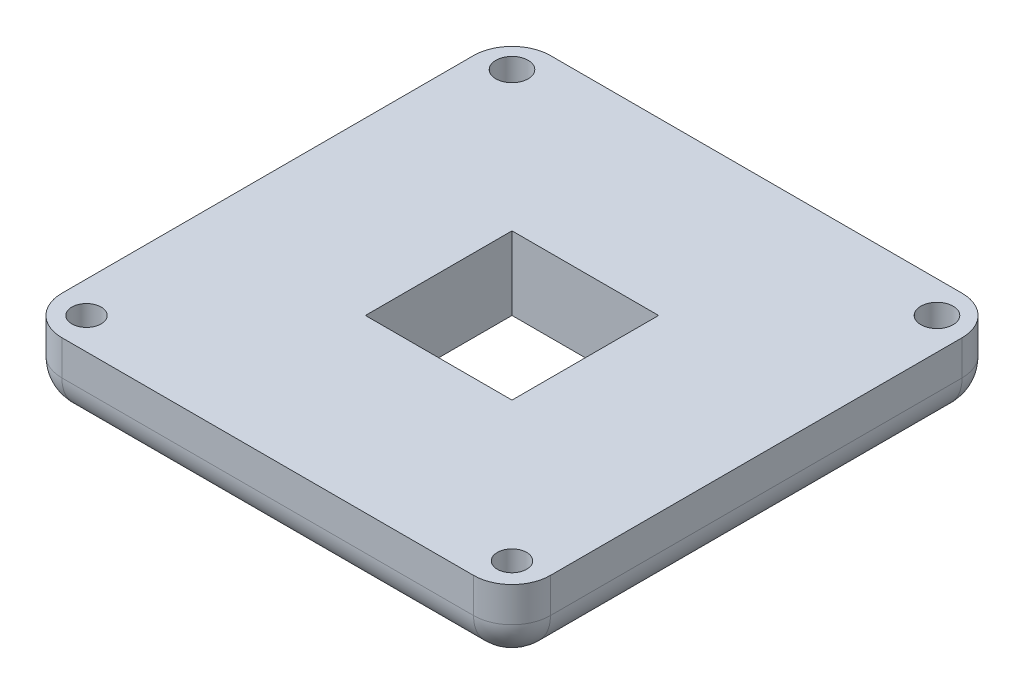
ISO-10303-21;
HEADER;
FILE_DESCRIPTION(('STEP AP214'),'2;1');
FILE_NAME('part.step','',(''),(''),'','','');
FILE_SCHEMA(('AUTOMOTIVE_DESIGN { 1 0 10303 214 1 1 1 1 }'));
ENDSEC;
DATA;
#1=APPLICATION_CONTEXT('core data for automotive mechanical design processes');
#2=APPLICATION_PROTOCOL_DEFINITION('international standard','automotive_design',2000,#1);
#3=PRODUCT_CONTEXT('',#1,'mechanical');
#4=PRODUCT('Part','Part','',(#3));
#5=PRODUCT_RELATED_PRODUCT_CATEGORY('part','',(#4));
#6=PRODUCT_DEFINITION_FORMATION('','',#4);
#7=PRODUCT_DEFINITION_CONTEXT('part definition',#1,'design');
#8=PRODUCT_DEFINITION('design','',#6,#7);
#9=PRODUCT_DEFINITION_SHAPE('','',#8);
#10=(LENGTH_UNIT() NAMED_UNIT(*) SI_UNIT(.MILLI.,.METRE.));
#11=(NAMED_UNIT(*) PLANE_ANGLE_UNIT() SI_UNIT($,.RADIAN.));
#12=(NAMED_UNIT(*) SI_UNIT($,.STERADIAN.) SOLID_ANGLE_UNIT());
#13=UNCERTAINTY_MEASURE_WITH_UNIT(LENGTH_MEASURE(1.E-05),#10,'distance_accuracy_value','');
#14=(GEOMETRIC_REPRESENTATION_CONTEXT(3) GLOBAL_UNCERTAINTY_ASSIGNED_CONTEXT((#13)) GLOBAL_UNIT_ASSIGNED_CONTEXT((#10,
#11,#12)) REPRESENTATION_CONTEXT('',''));
#15=CARTESIAN_POINT('',(0.,0.,0.));
#16=DIRECTION('',(0.,0.,1.));
#17=DIRECTION('',(1.,0.,0.));
#18=AXIS2_PLACEMENT_3D('',#15,#16,#17);
#19=CARTESIAN_POINT('',(44.45,19.05,57.15));
#20=DIRECTION('',(0.,1.,0.));
#21=DIRECTION('',(0.,0.,1.));
#22=AXIS2_PLACEMENT_3D('',#19,#20,#21);
#23=PLANE('',#22);
#24=CARTESIAN_POINT('',(-55.2998804280338,19.05,55.299880428034));
#25=DIRECTION('',(0.,1.,0.));
#26=DIRECTION('',(0.,0.,1.));
#27=AXIS2_PLACEMENT_3D('',#24,#25,#26);
#28=CIRCLE('',#27,3.81);
#29=CARTESIAN_POINT('',(-55.2998804280338,19.05,59.109880428034));
#30=VERTEX_POINT('',#29);
#31=EDGE_CURVE('E373',#30,#30,#28,.T.);
#32=ORIENTED_EDGE('',*,*,#31,.F.);
#33=EDGE_LOOP('',(#32));
#34=FACE_BOUND('',#33,.T.);
#35=CARTESIAN_POINT('',(-55.3528098040229,19.05,-55.3528098040229));
#36=DIRECTION('',(0.,1.,0.));
#37=DIRECTION('',(0.,0.,1.));
#38=AXIS2_PLACEMENT_3D('',#35,#36,#37);
#39=CIRCLE('',#38,4.191);
#40=CARTESIAN_POINT('',(-55.3528098040229,19.05,-51.1618098040229));
#41=VERTEX_POINT('',#40);
#42=EDGE_CURVE('E366',#41,#41,#39,.T.);
#43=ORIENTED_EDGE('',*,*,#42,.F.);
#44=EDGE_LOOP('',(#43));
#45=FACE_BOUND('',#44,.T.);
#46=CARTESIAN_POINT('',(55.230229682511,19.05,-55.2302296825111));
#47=DIRECTION('',(0.,1.,0.));
#48=DIRECTION('',(0.,0.,1.));
#49=AXIS2_PLACEMENT_3D('',#46,#47,#48);
#50=CIRCLE('',#49,4.191);
#51=CARTESIAN_POINT('',(55.230229682511,19.05,-51.0392296825111));
#52=VERTEX_POINT('',#51);
#53=EDGE_CURVE('E362',#52,#52,#50,.T.);
#54=ORIENTED_EDGE('',*,*,#53,.F.);
#55=EDGE_LOOP('',(#54));
#56=FACE_BOUND('',#55,.T.);
#57=CARTESIAN_POINT('',(55.230229682511,19.05,55.2302296825109));
#58=DIRECTION('',(0.,1.,0.));
#59=DIRECTION('',(0.,0.,1.));
#60=AXIS2_PLACEMENT_3D('',#57,#58,#59);
#61=CIRCLE('',#60,3.81);
#62=CARTESIAN_POINT('',(55.230229682511,19.05,59.0402296825109));
#63=VERTEX_POINT('',#62);
#64=EDGE_CURVE('E353',#63,#63,#61,.T.);
#65=ORIENTED_EDGE('',*,*,#64,.F.);
#66=EDGE_LOOP('',(#65));
#67=FACE_BOUND('',#66,.T.);
#68=DIRECTION('',(0.,0.,-1.));
#69=VECTOR('',#68,1.);
#70=CARTESIAN_POINT('',(63.5,19.05,44.45));
#71=LINE('',#70,#69);
#72=CARTESIAN_POINT('',(63.5,19.05,53.5));
#73=VERTEX_POINT('',#72);
#74=CARTESIAN_POINT('',(63.5,19.05,-53.5));
#75=VERTEX_POINT('',#74);
#76=EDGE_CURVE('E152',#73,#75,#71,.T.);
#77=ORIENTED_EDGE('',*,*,#76,.T.);
#78=CARTESIAN_POINT('',(53.5,19.05,-53.5));
#79=DIRECTION('',(0.,1.,0.));
#80=DIRECTION('',(0.,0.,1.));
#81=AXIS2_PLACEMENT_3D('',#78,#79,#80);
#82=CIRCLE('',#81,10.);
#83=CARTESIAN_POINT('',(53.5,19.05,-63.5));
#84=VERTEX_POINT('',#83);
#85=EDGE_CURVE('E201',#84,#75,#82,.F.);
#86=ORIENTED_EDGE('',*,*,#85,.F.);
#87=DIRECTION('',(1.,0.,0.));
#88=VECTOR('',#87,1.);
#89=CARTESIAN_POINT('',(-44.45,19.05,-63.5));
#90=LINE('',#89,#88);
#91=CARTESIAN_POINT('',(-53.5,19.05,-63.5));
#92=VERTEX_POINT('',#91);
#93=EDGE_CURVE('E221',#92,#84,#90,.T.);
#94=ORIENTED_EDGE('',*,*,#93,.F.);
#95=CARTESIAN_POINT('',(-53.5,19.05,-53.5));
#96=DIRECTION('',(0.,1.,0.));
#97=DIRECTION('',(0.,0.,1.));
#98=AXIS2_PLACEMENT_3D('',#95,#96,#97);
#99=CIRCLE('',#98,10.);
#100=CARTESIAN_POINT('',(-63.5,19.05,-53.5));
#101=VERTEX_POINT('',#100);
#102=EDGE_CURVE('E194',#101,#92,#99,.F.);
#103=ORIENTED_EDGE('',*,*,#102,.F.);
#104=DIRECTION('',(0.,0.,-1.));
#105=VECTOR('',#104,1.);
#106=CARTESIAN_POINT('',(-63.5,19.05,44.45));
#107=LINE('',#106,#105);
#108=CARTESIAN_POINT('',(-63.5,19.05,53.5));
#109=VERTEX_POINT('',#108);
#110=EDGE_CURVE('E164',#109,#101,#107,.T.);
#111=ORIENTED_EDGE('',*,*,#110,.F.);
#112=CARTESIAN_POINT('',(-53.5,19.05,53.5));
#113=DIRECTION('',(0.,1.,0.));
#114=DIRECTION('',(0.,0.,1.));
#115=AXIS2_PLACEMENT_3D('',#112,#113,#114);
#116=CIRCLE('',#115,10.);
#117=CARTESIAN_POINT('',(-53.5,19.05,63.5));
#118=VERTEX_POINT('',#117);
#119=EDGE_CURVE('E174',#118,#109,#116,.F.);
#120=ORIENTED_EDGE('',*,*,#119,.F.);
#121=DIRECTION('',(1.,0.,0.));
#122=VECTOR('',#121,1.);
#123=CARTESIAN_POINT('',(-44.45,19.05,63.5));
#124=LINE('',#123,#122);
#125=CARTESIAN_POINT('',(53.5,19.05,63.5));
#126=VERTEX_POINT('',#125);
#127=EDGE_CURVE('E169',#118,#126,#124,.T.);
#128=ORIENTED_EDGE('',*,*,#127,.T.);
#129=CARTESIAN_POINT('',(53.5,19.05,53.5));
#130=DIRECTION('',(0.,1.,0.));
#131=DIRECTION('',(0.,0.,1.));
#132=AXIS2_PLACEMENT_3D('',#129,#130,#131);
#133=CIRCLE('',#132,10.);
#134=EDGE_CURVE('E52',#73,#126,#133,.F.);
#135=ORIENTED_EDGE('',*,*,#134,.F.);
#136=EDGE_LOOP('',(#77,#86,#94,#103,#111,#120,#128,#135));
#137=FACE_BOUND('',#136,.T.);
#138=DIRECTION('',(-1.,0.,0.));
#139=VECTOR('',#138,1.);
#140=CARTESIAN_POINT('',(-19.05,19.05,19.05));
#141=LINE('',#140,#139);
#142=CARTESIAN_POINT('',(19.05,19.05,19.05));
#143=VERTEX_POINT('',#142);
#144=CARTESIAN_POINT('',(-19.05,19.05,19.05));
#145=VERTEX_POINT('',#144);
#146=EDGE_CURVE('E336',#143,#145,#141,.T.);
#147=ORIENTED_EDGE('',*,*,#146,.T.);
#148=DIRECTION('',(0.,0.,-1.));
#149=VECTOR('',#148,1.);
#150=CARTESIAN_POINT('',(-19.05,19.05,-19.05));
#151=LINE('',#150,#149);
#152=CARTESIAN_POINT('',(-19.05,19.05,-19.05));
#153=VERTEX_POINT('',#152);
#154=EDGE_CURVE('E66',#145,#153,#151,.T.);
#155=ORIENTED_EDGE('',*,*,#154,.T.);
#156=DIRECTION('',(-1.,0.,0.));
#157=VECTOR('',#156,1.);
#158=CARTESIAN_POINT('',(-19.05,19.05,-19.05));
#159=LINE('',#158,#157);
#160=CARTESIAN_POINT('',(19.05,19.05,-19.05));
#161=VERTEX_POINT('',#160);
#162=EDGE_CURVE('E212',#161,#153,#159,.T.);
#163=ORIENTED_EDGE('',*,*,#162,.F.);
#164=DIRECTION('',(0.,0.,-1.));
#165=VECTOR('',#164,1.);
#166=CARTESIAN_POINT('',(19.05,19.05,-19.05));
#167=LINE('',#166,#165);
#168=EDGE_CURVE('E74',#143,#161,#167,.T.);
#169=ORIENTED_EDGE('',*,*,#168,.F.);
#170=EDGE_LOOP('',(#147,#155,#163,#169));
#171=FACE_BOUND('',#170,.T.);
#172=ADVANCED_FACE('F48',(#34,#45,#56,#67,#137,#171),#23,.T.);
#173=CARTESIAN_POINT('',(63.5,107.95,63.5));
#174=DIRECTION('',(0.,0.,1.));
#175=DIRECTION('',(1.,0.,0.));
#176=AXIS2_PLACEMENT_3D('',#173,#174,#175);
#177=PLANE('',#176);
#178=DIRECTION('',(0.,-1.,0.));
#179=VECTOR('',#178,1.);
#180=CARTESIAN_POINT('',(53.5,107.95,63.5));
#181=LINE('',#180,#179);
#182=CARTESIAN_POINT('',(53.5,10.,63.5));
#183=VERTEX_POINT('',#182);
#184=EDGE_CURVE('E191',#183,#126,#181,.F.);
#185=ORIENTED_EDGE('',*,*,#184,.T.);
#186=ORIENTED_EDGE('',*,*,#127,.F.);
#187=DIRECTION('',(0.,-1.,0.));
#188=VECTOR('',#187,1.);
#189=CARTESIAN_POINT('',(-53.5,0.,63.5));
#190=LINE('',#189,#188);
#191=CARTESIAN_POINT('',(-53.5,10.,63.5));
#192=VERTEX_POINT('',#191);
#193=EDGE_CURVE('E198',#118,#192,#190,.T.);
#194=ORIENTED_EDGE('',*,*,#193,.T.);
#195=DIRECTION('',(-1.,0.,0.));
#196=VECTOR('',#195,1.);
#197=CARTESIAN_POINT('',(63.5,10.,63.5));
#198=LINE('',#197,#196);
#199=EDGE_CURVE('E193',#192,#183,#198,.F.);
#200=ORIENTED_EDGE('',*,*,#199,.T.);
#201=EDGE_LOOP('',(#185,#186,#194,#200));
#202=FACE_BOUND('',#201,.T.);
#203=ADVANCED_FACE('F231',(#202),#177,.T.);
#204=CARTESIAN_POINT('',(63.5,107.95,-63.5));
#205=DIRECTION('',(0.,0.,1.));
#206=DIRECTION('',(1.,0.,0.));
#207=AXIS2_PLACEMENT_3D('',#204,#205,#206);
#208=PLANE('',#207);
#209=ORIENTED_EDGE('',*,*,#93,.T.);
#210=DIRECTION('',(0.,-1.,0.));
#211=VECTOR('',#210,1.);
#212=CARTESIAN_POINT('',(53.5,0.,-63.5));
#213=LINE('',#212,#211);
#214=CARTESIAN_POINT('',(53.5,9.99999999999999,-63.5));
#215=VERTEX_POINT('',#214);
#216=EDGE_CURVE('E223',#84,#215,#213,.T.);
#217=ORIENTED_EDGE('',*,*,#216,.T.);
#218=DIRECTION('',(-1.,0.,0.));
#219=VECTOR('',#218,1.);
#220=CARTESIAN_POINT('',(63.5,9.99999999999999,-63.5));
#221=LINE('',#220,#219);
#222=CARTESIAN_POINT('',(-53.5,9.99999999999999,-63.5));
#223=VERTEX_POINT('',#222);
#224=EDGE_CURVE('E222',#215,#223,#221,.T.);
#225=ORIENTED_EDGE('',*,*,#224,.T.);
#226=DIRECTION('',(0.,-1.,0.));
#227=VECTOR('',#226,1.);
#228=CARTESIAN_POINT('',(-53.5,107.95,-63.5));
#229=LINE('',#228,#227);
#230=EDGE_CURVE('E218',#223,#92,#229,.F.);
#231=ORIENTED_EDGE('',*,*,#230,.T.);
#232=EDGE_LOOP('',(#209,#217,#225,#231));
#233=FACE_BOUND('',#232,.T.);
#234=ADVANCED_FACE('F418',(#233),#208,.F.);
#235=CARTESIAN_POINT('',(63.5,107.95,-63.5));
#236=DIRECTION('',(1.,0.,0.));
#237=DIRECTION('',(0.,0.,-1.));
#238=AXIS2_PLACEMENT_3D('',#235,#236,#237);
#239=PLANE('',#238);
#240=DIRECTION('',(0.,-1.,0.));
#241=VECTOR('',#240,1.);
#242=CARTESIAN_POINT('',(63.5,107.95,-53.5));
#243=LINE('',#242,#241);
#244=CARTESIAN_POINT('',(63.5,10.,-53.5));
#245=VERTEX_POINT('',#244);
#246=EDGE_CURVE('E159',#245,#75,#243,.F.);
#247=ORIENTED_EDGE('',*,*,#246,.T.);
#248=ORIENTED_EDGE('',*,*,#76,.F.);
#249=DIRECTION('',(0.,-1.,0.));
#250=VECTOR('',#249,1.);
#251=CARTESIAN_POINT('',(63.5,107.95,53.5));
#252=LINE('',#251,#250);
#253=CARTESIAN_POINT('',(63.5,10.,53.5));
#254=VERTEX_POINT('',#253);
#255=EDGE_CURVE('E156',#73,#254,#252,.T.);
#256=ORIENTED_EDGE('',*,*,#255,.T.);
#257=DIRECTION('',(0.,0.,1.));
#258=VECTOR('',#257,1.);
#259=CARTESIAN_POINT('',(63.5,10.,-63.5));
#260=LINE('',#259,#258);
#261=EDGE_CURVE('E181',#254,#245,#260,.F.);
#262=ORIENTED_EDGE('',*,*,#261,.T.);
#263=EDGE_LOOP('',(#247,#248,#256,#262));
#264=FACE_BOUND('',#263,.T.);
#265=ADVANCED_FACE('F154',(#264),#239,.T.);
#266=CARTESIAN_POINT('',(-63.5,107.95,-63.5));
#267=DIRECTION('',(1.,0.,0.));
#268=DIRECTION('',(0.,0.,-1.));
#269=AXIS2_PLACEMENT_3D('',#266,#267,#268);
#270=PLANE('',#269);
#271=ORIENTED_EDGE('',*,*,#110,.T.);
#272=DIRECTION('',(0.,-1.,0.));
#273=VECTOR('',#272,1.);
#274=CARTESIAN_POINT('',(-63.5,107.95,-53.5));
#275=LINE('',#274,#273);
#276=CARTESIAN_POINT('',(-63.5,9.99999999999999,-53.5));
#277=VERTEX_POINT('',#276);
#278=EDGE_CURVE('E214',#101,#277,#275,.T.);
#279=ORIENTED_EDGE('',*,*,#278,.T.);
#280=DIRECTION('',(0.,0.,1.));
#281=VECTOR('',#280,1.);
#282=CARTESIAN_POINT('',(-63.5,9.99999999999999,-63.5));
#283=LINE('',#282,#281);
#284=CARTESIAN_POINT('',(-63.5,9.99999999999999,53.5));
#285=VERTEX_POINT('',#284);
#286=EDGE_CURVE('E186',#277,#285,#283,.T.);
#287=ORIENTED_EDGE('',*,*,#286,.T.);
#288=DIRECTION('',(0.,-1.,0.));
#289=VECTOR('',#288,1.);
#290=CARTESIAN_POINT('',(-63.5,107.95,53.5));
#291=LINE('',#290,#289);
#292=EDGE_CURVE('E180',#285,#109,#291,.F.);
#293=ORIENTED_EDGE('',*,*,#292,.T.);
#294=EDGE_LOOP('',(#271,#279,#287,#293));
#295=FACE_BOUND('',#294,.T.);
#296=ADVANCED_FACE('F426',(#295),#270,.F.);
#297=CARTESIAN_POINT('',(53.5,107.95,53.5));
#298=DIRECTION('',(0.,-1.,0.));
#299=DIRECTION('',(0.,0.,-1.));
#300=AXIS2_PLACEMENT_3D('',#297,#298,#299);
#301=CYLINDRICAL_SURFACE('',#300,10.);
#302=ORIENTED_EDGE('',*,*,#255,.F.);
#303=ORIENTED_EDGE('',*,*,#134,.T.);
#304=ORIENTED_EDGE('',*,*,#184,.F.);
#305=CARTESIAN_POINT('',(53.5,10.,53.5));
#306=DIRECTION('',(0.,-1.,0.));
#307=DIRECTION('',(0.,0.,-1.));
#308=AXIS2_PLACEMENT_3D('',#305,#306,#307);
#309=CIRCLE('',#308,10.);
#310=EDGE_CURVE('E177',#254,#183,#309,.T.);
#311=ORIENTED_EDGE('',*,*,#310,.F.);
#312=EDGE_LOOP('',(#302,#303,#304,#311));
#313=FACE_BOUND('',#312,.T.);
#314=ADVANCED_FACE('F50',(#313),#301,.T.);
#315=CARTESIAN_POINT('',(-53.5,107.95,53.5));
#316=DIRECTION('',(0.,1.,0.));
#317=DIRECTION('',(0.,0.,1.));
#318=AXIS2_PLACEMENT_3D('',#315,#316,#317);
#319=CYLINDRICAL_SURFACE('',#318,10.);
#320=ORIENTED_EDGE('',*,*,#193,.F.);
#321=ORIENTED_EDGE('',*,*,#119,.T.);
#322=ORIENTED_EDGE('',*,*,#292,.F.);
#323=CARTESIAN_POINT('',(-53.5,10.,53.5));
#324=DIRECTION('',(0.,-1.,0.));
#325=DIRECTION('',(1.,0.,0.));
#326=AXIS2_PLACEMENT_3D('',#323,#324,#325);
#327=CIRCLE('',#326,10.);
#328=EDGE_CURVE('E247',#192,#285,#327,.T.);
#329=ORIENTED_EDGE('',*,*,#328,.F.);
#330=EDGE_LOOP('',(#320,#321,#322,#329));
#331=FACE_BOUND('',#330,.T.);
#332=ADVANCED_FACE('F248',(#331),#319,.T.);
#333=CARTESIAN_POINT('',(53.5,107.95,-53.5));
#334=DIRECTION('',(0.,1.,0.));
#335=DIRECTION('',(0.,0.,1.));
#336=AXIS2_PLACEMENT_3D('',#333,#334,#335);
#337=CYLINDRICAL_SURFACE('',#336,10.);
#338=ORIENTED_EDGE('',*,*,#216,.F.);
#339=ORIENTED_EDGE('',*,*,#85,.T.);
#340=ORIENTED_EDGE('',*,*,#246,.F.);
#341=CARTESIAN_POINT('',(53.5,9.99999999999999,-53.5));
#342=DIRECTION('',(0.,-1.,0.));
#343=DIRECTION('',(1.,0.,0.));
#344=AXIS2_PLACEMENT_3D('',#341,#342,#343);
#345=CIRCLE('',#344,10.);
#346=EDGE_CURVE('E270',#215,#245,#345,.T.);
#347=ORIENTED_EDGE('',*,*,#346,.F.);
#348=EDGE_LOOP('',(#338,#339,#340,#347));
#349=FACE_BOUND('',#348,.T.);
#350=ADVANCED_FACE('F430',(#349),#337,.T.);
#351=CARTESIAN_POINT('',(-53.5,107.95,-53.5));
#352=DIRECTION('',(0.,-1.,0.));
#353=DIRECTION('',(0.,0.,-1.));
#354=AXIS2_PLACEMENT_3D('',#351,#352,#353);
#355=CYLINDRICAL_SURFACE('',#354,10.);
#356=ORIENTED_EDGE('',*,*,#278,.F.);
#357=ORIENTED_EDGE('',*,*,#102,.T.);
#358=ORIENTED_EDGE('',*,*,#230,.F.);
#359=CARTESIAN_POINT('',(-53.5,9.99999999999999,-53.5));
#360=DIRECTION('',(0.,-1.,0.));
#361=DIRECTION('',(0.,0.,-1.));
#362=AXIS2_PLACEMENT_3D('',#359,#360,#361);
#363=CIRCLE('',#362,10.);
#364=EDGE_CURVE('E274',#277,#223,#363,.T.);
#365=ORIENTED_EDGE('',*,*,#364,.F.);
#366=EDGE_LOOP('',(#356,#357,#358,#365));
#367=FACE_BOUND('',#366,.T.);
#368=ADVANCED_FACE('F435',(#367),#355,.T.);
#369=CARTESIAN_POINT('',(0.,0.,0.));
#370=DIRECTION('',(0.,1.,0.));
#371=DIRECTION('',(0.,0.,1.));
#372=AXIS2_PLACEMENT_3D('',#369,#370,#371);
#373=PLANE('',#372);
#374=DIRECTION('',(0.,0.,1.));
#375=VECTOR('',#374,1.);
#376=CARTESIAN_POINT('',(-53.5,0.,0.));
#377=LINE('',#376,#375);
#378=CARTESIAN_POINT('',(-53.5,0.,53.5));
#379=VERTEX_POINT('',#378);
#380=CARTESIAN_POINT('',(-53.5,0.,-53.5));
#381=VERTEX_POINT('',#380);
#382=EDGE_CURVE('E289',#379,#381,#377,.F.);
#383=ORIENTED_EDGE('',*,*,#382,.T.);
#384=DIRECTION('',(-1.,0.,0.));
#385=VECTOR('',#384,1.);
#386=CARTESIAN_POINT('',(0.,0.,-53.5));
#387=LINE('',#386,#385);
#388=CARTESIAN_POINT('',(53.5,0.,-53.5));
#389=VERTEX_POINT('',#388);
#390=EDGE_CURVE('E217',#381,#389,#387,.F.);
#391=ORIENTED_EDGE('',*,*,#390,.T.);
#392=DIRECTION('',(0.,0.,1.));
#393=VECTOR('',#392,1.);
#394=CARTESIAN_POINT('',(53.5,0.,63.5));
#395=LINE('',#394,#393);
#396=CARTESIAN_POINT('',(53.5,0.,53.5));
#397=VERTEX_POINT('',#396);
#398=EDGE_CURVE('E292',#389,#397,#395,.T.);
#399=ORIENTED_EDGE('',*,*,#398,.T.);
#400=DIRECTION('',(-1.,0.,0.));
#401=VECTOR('',#400,1.);
#402=CARTESIAN_POINT('',(-63.5,0.,53.5));
#403=LINE('',#402,#401);
#404=EDGE_CURVE('E226',#397,#379,#403,.T.);
#405=ORIENTED_EDGE('',*,*,#404,.T.);
#406=EDGE_LOOP('',(#383,#391,#399,#405));
#407=FACE_BOUND('',#406,.T.);
#408=DIRECTION('',(1.,0.,0.));
#409=VECTOR('',#408,1.);
#410=CARTESIAN_POINT('',(-19.05,0.,19.05));
#411=LINE('',#410,#409);
#412=CARTESIAN_POINT('',(-19.05,0.,19.05));
#413=VERTEX_POINT('',#412);
#414=CARTESIAN_POINT('',(19.05,0.,19.05));
#415=VERTEX_POINT('',#414);
#416=EDGE_CURVE('E332',#413,#415,#411,.T.);
#417=ORIENTED_EDGE('',*,*,#416,.T.);
#418=DIRECTION('',(0.,0.,1.));
#419=VECTOR('',#418,1.);
#420=CARTESIAN_POINT('',(19.05,0.,-19.05));
#421=LINE('',#420,#419);
#422=CARTESIAN_POINT('',(19.05,0.,-19.05));
#423=VERTEX_POINT('',#422);
#424=EDGE_CURVE('E328',#423,#415,#421,.T.);
#425=ORIENTED_EDGE('',*,*,#424,.F.);
#426=DIRECTION('',(1.,0.,0.));
#427=VECTOR('',#426,1.);
#428=CARTESIAN_POINT('',(-19.05,0.,-19.05));
#429=LINE('',#428,#427);
#430=CARTESIAN_POINT('',(-19.05,0.,-19.05));
#431=VERTEX_POINT('',#430);
#432=EDGE_CURVE('E324',#431,#423,#429,.T.);
#433=ORIENTED_EDGE('',*,*,#432,.F.);
#434=DIRECTION('',(0.,0.,1.));
#435=VECTOR('',#434,1.);
#436=CARTESIAN_POINT('',(-19.05,0.,-19.05));
#437=LINE('',#436,#435);
#438=EDGE_CURVE('E320',#431,#413,#437,.T.);
#439=ORIENTED_EDGE('',*,*,#438,.T.);
#440=EDGE_LOOP('',(#417,#425,#433,#439));
#441=FACE_BOUND('',#440,.T.);
#442=ADVANCED_FACE('F440',(#407,#441),#373,.F.);
#443=CARTESIAN_POINT('',(-19.05,107.951,19.05));
#444=DIRECTION('',(0.,0.,-1.));
#445=DIRECTION('',(-1.,0.,0.));
#446=AXIS2_PLACEMENT_3D('',#443,#444,#445);
#447=PLANE('',#446);
#448=DIRECTION('',(0.,-1.,0.));
#449=VECTOR('',#448,1.);
#450=CARTESIAN_POINT('',(19.05,107.951,19.05));
#451=LINE('',#450,#449);
#452=EDGE_CURVE('E308',#143,#415,#451,.T.);
#453=ORIENTED_EDGE('',*,*,#452,.T.);
#454=ORIENTED_EDGE('',*,*,#416,.F.);
#455=DIRECTION('',(0.,-1.,0.));
#456=VECTOR('',#455,1.);
#457=CARTESIAN_POINT('',(-19.05,107.951,19.05));
#458=LINE('',#457,#456);
#459=EDGE_CURVE('E317',#145,#413,#458,.T.);
#460=ORIENTED_EDGE('',*,*,#459,.F.);
#461=ORIENTED_EDGE('',*,*,#146,.F.);
#462=EDGE_LOOP('',(#453,#454,#460,#461));
#463=FACE_BOUND('',#462,.T.);
#464=ADVANCED_FACE('F450',(#463),#447,.T.);
#465=CARTESIAN_POINT('',(19.05,107.951,-19.05));
#466=DIRECTION('',(1.,0.,0.));
#467=DIRECTION('',(0.,0.,-1.));
#468=AXIS2_PLACEMENT_3D('',#465,#466,#467);
#469=PLANE('',#468);
#470=ORIENTED_EDGE('',*,*,#168,.T.);
#471=DIRECTION('',(0.,-1.,0.));
#472=VECTOR('',#471,1.);
#473=CARTESIAN_POINT('',(19.05,107.951,-19.05));
#474=LINE('',#473,#472);
#475=EDGE_CURVE('E311',#161,#423,#474,.T.);
#476=ORIENTED_EDGE('',*,*,#475,.T.);
#477=ORIENTED_EDGE('',*,*,#424,.T.);
#478=ORIENTED_EDGE('',*,*,#452,.F.);
#479=EDGE_LOOP('',(#470,#476,#477,#478));
#480=FACE_BOUND('',#479,.T.);
#481=ADVANCED_FACE('F447',(#480),#469,.F.);
#482=CARTESIAN_POINT('',(-19.05,107.951,-19.05));
#483=DIRECTION('',(0.,0.,-1.));
#484=DIRECTION('',(-1.,0.,0.));
#485=AXIS2_PLACEMENT_3D('',#482,#483,#484);
#486=PLANE('',#485);
#487=ORIENTED_EDGE('',*,*,#162,.T.);
#488=DIRECTION('',(0.,-1.,0.));
#489=VECTOR('',#488,1.);
#490=CARTESIAN_POINT('',(-19.05,107.951,-19.05));
#491=LINE('',#490,#489);
#492=EDGE_CURVE('E314',#153,#431,#491,.T.);
#493=ORIENTED_EDGE('',*,*,#492,.T.);
#494=ORIENTED_EDGE('',*,*,#432,.T.);
#495=ORIENTED_EDGE('',*,*,#475,.F.);
#496=EDGE_LOOP('',(#487,#493,#494,#495));
#497=FACE_BOUND('',#496,.T.);
#498=ADVANCED_FACE('F444',(#497),#486,.F.);
#499=CARTESIAN_POINT('',(-19.05,107.951,-19.05));
#500=DIRECTION('',(1.,0.,0.));
#501=DIRECTION('',(0.,0.,-1.));
#502=AXIS2_PLACEMENT_3D('',#499,#500,#501);
#503=PLANE('',#502);
#504=ORIENTED_EDGE('',*,*,#459,.T.);
#505=ORIENTED_EDGE('',*,*,#438,.F.);
#506=ORIENTED_EDGE('',*,*,#492,.F.);
#507=ORIENTED_EDGE('',*,*,#154,.F.);
#508=EDGE_LOOP('',(#504,#505,#506,#507));
#509=FACE_BOUND('',#508,.T.);
#510=ADVANCED_FACE('F441',(#509),#503,.T.);
#511=CARTESIAN_POINT('',(0.,10.,53.5));
#512=DIRECTION('',(1.,0.,0.));
#513=DIRECTION('',(0.,0.,-1.));
#514=AXIS2_PLACEMENT_3D('',#511,#512,#513);
#515=CYLINDRICAL_SURFACE('',#514,10.);
#516=CARTESIAN_POINT('',(53.5,10.,53.5));
#517=DIRECTION('',(1.,0.,0.));
#518=DIRECTION('',(0.,0.,-1.));
#519=AXIS2_PLACEMENT_3D('',#516,#517,#518);
#520=CIRCLE('',#519,10.);
#521=EDGE_CURVE('E244',#183,#397,#520,.T.);
#522=ORIENTED_EDGE('',*,*,#521,.F.);
#523=ORIENTED_EDGE('',*,*,#199,.F.);
#524=CARTESIAN_POINT('',(-53.5,10.,53.5));
#525=DIRECTION('',(-1.,0.,0.));
#526=DIRECTION('',(0.,0.,1.));
#527=AXIS2_PLACEMENT_3D('',#524,#525,#526);
#528=CIRCLE('',#527,10.);
#529=EDGE_CURVE('E241',#379,#192,#528,.T.);
#530=ORIENTED_EDGE('',*,*,#529,.F.);
#531=ORIENTED_EDGE('',*,*,#404,.F.);
#532=EDGE_LOOP('',(#522,#523,#530,#531));
#533=FACE_BOUND('',#532,.T.);
#534=ADVANCED_FACE('F238',(#533),#515,.T.);
#535=CARTESIAN_POINT('',(53.5,10.,53.5));
#536=DIRECTION('',(0.,0.,1.));
#537=DIRECTION('',(1.,0.,0.));
#538=AXIS2_PLACEMENT_3D('',#535,#536,#537);
#539=SPHERICAL_SURFACE('',#538,10.);
#540=ORIENTED_EDGE('',*,*,#310,.T.);
#541=ORIENTED_EDGE('',*,*,#521,.T.);
#542=CARTESIAN_POINT('',(53.5,10.,53.5));
#543=DIRECTION('',(0.,0.,1.));
#544=DIRECTION('',(1.,0.,0.));
#545=AXIS2_PLACEMENT_3D('',#542,#543,#544);
#546=CIRCLE('',#545,10.);
#547=EDGE_CURVE('E257',#254,#397,#546,.F.);
#548=ORIENTED_EDGE('',*,*,#547,.F.);
#549=EDGE_LOOP('',(#540,#541,#548));
#550=FACE_BOUND('',#549,.T.);
#551=ADVANCED_FACE('F474',(#550),#539,.T.);
#552=CARTESIAN_POINT('',(-53.5,10.,53.5));
#553=DIRECTION('',(0.,0.,1.));
#554=DIRECTION('',(1.,0.,0.));
#555=AXIS2_PLACEMENT_3D('',#552,#553,#554);
#556=SPHERICAL_SURFACE('',#555,10.);
#557=ORIENTED_EDGE('',*,*,#529,.T.);
#558=ORIENTED_EDGE('',*,*,#328,.T.);
#559=CARTESIAN_POINT('',(-53.5,9.99999999999999,53.5));
#560=DIRECTION('',(0.,0.,1.));
#561=DIRECTION('',(1.,0.,0.));
#562=AXIS2_PLACEMENT_3D('',#559,#560,#561);
#563=CIRCLE('',#562,10.);
#564=EDGE_CURVE('E254',#379,#285,#563,.F.);
#565=ORIENTED_EDGE('',*,*,#564,.F.);
#566=EDGE_LOOP('',(#557,#558,#565));
#567=FACE_BOUND('',#566,.T.);
#568=ADVANCED_FACE('F253',(#567),#556,.T.);
#569=CARTESIAN_POINT('',(53.5,10.,0.));
#570=DIRECTION('',(0.,0.,-1.));
#571=DIRECTION('',(-1.,0.,0.));
#572=AXIS2_PLACEMENT_3D('',#569,#570,#571);
#573=CYLINDRICAL_SURFACE('',#572,10.);
#574=ORIENTED_EDGE('',*,*,#547,.T.);
#575=ORIENTED_EDGE('',*,*,#398,.F.);
#576=CARTESIAN_POINT('',(53.5,10.,-53.5));
#577=DIRECTION('',(0.,0.,-1.));
#578=DIRECTION('',(-1.,0.,0.));
#579=AXIS2_PLACEMENT_3D('',#576,#577,#578);
#580=CIRCLE('',#579,10.);
#581=EDGE_CURVE('E266',#245,#389,#580,.T.);
#582=ORIENTED_EDGE('',*,*,#581,.F.);
#583=ORIENTED_EDGE('',*,*,#261,.F.);
#584=EDGE_LOOP('',(#574,#575,#582,#583));
#585=FACE_BOUND('',#584,.T.);
#586=ADVANCED_FACE('F467',(#585),#573,.T.);
#587=CARTESIAN_POINT('',(-53.5,9.99999999999999,-63.5));
#588=DIRECTION('',(0.,0.,1.));
#589=DIRECTION('',(1.,0.,0.));
#590=AXIS2_PLACEMENT_3D('',#587,#588,#589);
#591=CYLINDRICAL_SURFACE('',#590,10.);
#592=ORIENTED_EDGE('',*,*,#564,.T.);
#593=ORIENTED_EDGE('',*,*,#286,.F.);
#594=CARTESIAN_POINT('',(-53.5,10.,-53.5));
#595=DIRECTION('',(0.,0.,-1.));
#596=DIRECTION('',(-1.,0.,0.));
#597=AXIS2_PLACEMENT_3D('',#594,#595,#596);
#598=CIRCLE('',#597,10.);
#599=EDGE_CURVE('E278',#381,#277,#598,.T.);
#600=ORIENTED_EDGE('',*,*,#599,.F.);
#601=ORIENTED_EDGE('',*,*,#382,.F.);
#602=EDGE_LOOP('',(#592,#593,#600,#601));
#603=FACE_BOUND('',#602,.T.);
#604=ADVANCED_FACE('F463',(#603),#591,.T.);
#605=CARTESIAN_POINT('',(53.5,10.,-53.5));
#606=DIRECTION('',(1.,0.,0.));
#607=DIRECTION('',(0.,0.,-1.));
#608=AXIS2_PLACEMENT_3D('',#605,#606,#607);
#609=SPHERICAL_SURFACE('',#608,10.);
#610=ORIENTED_EDGE('',*,*,#346,.T.);
#611=ORIENTED_EDGE('',*,*,#581,.T.);
#612=CARTESIAN_POINT('',(53.5,10.,-53.5));
#613=DIRECTION('',(1.,0.,0.));
#614=DIRECTION('',(0.,0.,-1.));
#615=AXIS2_PLACEMENT_3D('',#612,#613,#614);
#616=CIRCLE('',#615,10.);
#617=EDGE_CURVE('E58',#215,#389,#616,.F.);
#618=ORIENTED_EDGE('',*,*,#617,.F.);
#619=EDGE_LOOP('',(#610,#611,#618));
#620=FACE_BOUND('',#619,.T.);
#621=ADVANCED_FACE('F459',(#620),#609,.T.);
#622=CARTESIAN_POINT('',(-53.5,10.,-53.5));
#623=DIRECTION('',(-1.,0.,0.));
#624=DIRECTION('',(0.,-1.,0.));
#625=AXIS2_PLACEMENT_3D('',#622,#623,#624);
#626=SPHERICAL_SURFACE('',#625,10.);
#627=ORIENTED_EDGE('',*,*,#599,.T.);
#628=ORIENTED_EDGE('',*,*,#364,.T.);
#629=CARTESIAN_POINT('',(-53.5,9.99999999999999,-53.5));
#630=DIRECTION('',(-1.,0.,0.));
#631=DIRECTION('',(0.,0.,1.));
#632=AXIS2_PLACEMENT_3D('',#629,#630,#631);
#633=CIRCLE('',#632,10.);
#634=EDGE_CURVE('E11',#381,#223,#633,.F.);
#635=ORIENTED_EDGE('',*,*,#634,.F.);
#636=EDGE_LOOP('',(#627,#628,#635));
#637=FACE_BOUND('',#636,.T.);
#638=ADVANCED_FACE('F412',(#637),#626,.T.);
#639=CARTESIAN_POINT('',(63.5,9.99999999999999,-53.5));
#640=DIRECTION('',(-1.,0.,0.));
#641=DIRECTION('',(0.,0.,1.));
#642=AXIS2_PLACEMENT_3D('',#639,#640,#641);
#643=CYLINDRICAL_SURFACE('',#642,10.);
#644=ORIENTED_EDGE('',*,*,#617,.T.);
#645=ORIENTED_EDGE('',*,*,#390,.F.);
#646=ORIENTED_EDGE('',*,*,#634,.T.);
#647=ORIENTED_EDGE('',*,*,#224,.F.);
#648=EDGE_LOOP('',(#644,#645,#646,#647));
#649=FACE_BOUND('',#648,.T.);
#650=ADVANCED_FACE('F394',(#649),#643,.T.);
#651=CARTESIAN_POINT('',(55.230229682511,6.35,55.2302296825109));
#652=DIRECTION('',(0.,1.,0.));
#653=DIRECTION('',(0.,0.,1.));
#654=AXIS2_PLACEMENT_3D('',#651,#652,#653);
#655=CYLINDRICAL_SURFACE('',#654,3.81);
#656=CARTESIAN_POINT('',(55.230229682511,6.35,55.2302296825109));
#657=DIRECTION('',(0.,1.,0.));
#658=DIRECTION('',(0.,0.,1.));
#659=AXIS2_PLACEMENT_3D('',#656,#657,#658);
#660=CIRCLE('',#659,3.81);
#661=CARTESIAN_POINT('',(55.230229682511,6.35,59.0402296825109));
#662=VERTEX_POINT('',#661);
#663=EDGE_CURVE('E349',#662,#662,#660,.T.);
#664=ORIENTED_EDGE('',*,*,#663,.F.);
#665=EDGE_LOOP('',(#664));
#666=FACE_BOUND('',#665,.T.);
#667=ORIENTED_EDGE('',*,*,#64,.T.);
#668=EDGE_LOOP('',(#667));
#669=FACE_BOUND('',#668,.T.);
#670=ADVANCED_FACE('F393',(#666,#669),#655,.F.);
#671=CARTESIAN_POINT('',(55.230229682511,6.35,55.2302296825109));
#672=DIRECTION('',(0.,1.,0.));
#673=DIRECTION('',(0.,0.,1.));
#674=AXIS2_PLACEMENT_3D('',#671,#672,#673);
#675=PLANE('',#674);
#676=ORIENTED_EDGE('',*,*,#663,.T.);
#677=EDGE_LOOP('',(#676));
#678=FACE_BOUND('',#677,.T.);
#679=ADVANCED_FACE('F402',(#678),#675,.T.);
#680=CARTESIAN_POINT('',(55.230229682511,6.35,-55.2302296825111));
#681=DIRECTION('',(0.,1.,0.));
#682=DIRECTION('',(0.,0.,1.));
#683=AXIS2_PLACEMENT_3D('',#680,#681,#682);
#684=CYLINDRICAL_SURFACE('',#683,4.191);
#685=CARTESIAN_POINT('',(55.230229682511,6.35,-55.2302296825111));
#686=DIRECTION('',(0.,1.,0.));
#687=DIRECTION('',(0.,0.,1.));
#688=AXIS2_PLACEMENT_3D('',#685,#686,#687);
#689=CIRCLE('',#688,4.191);
#690=CARTESIAN_POINT('',(55.230229682511,6.35,-51.0392296825111));
#691=VERTEX_POINT('',#690);
#692=EDGE_CURVE('E358',#691,#691,#689,.T.);
#693=ORIENTED_EDGE('',*,*,#692,.F.);
#694=EDGE_LOOP('',(#693));
#695=FACE_BOUND('',#694,.T.);
#696=ORIENTED_EDGE('',*,*,#53,.T.);
#697=EDGE_LOOP('',(#696));
#698=FACE_BOUND('',#697,.T.);
#699=ADVANCED_FACE('F409',(#695,#698),#684,.F.);
#700=CARTESIAN_POINT('',(55.230229682511,6.35,-55.2302296825111));
#701=DIRECTION('',(0.,1.,0.));
#702=DIRECTION('',(0.,0.,1.));
#703=AXIS2_PLACEMENT_3D('',#700,#701,#702);
#704=PLANE('',#703);
#705=ORIENTED_EDGE('',*,*,#692,.T.);
#706=EDGE_LOOP('',(#705));
#707=FACE_BOUND('',#706,.T.);
#708=ADVANCED_FACE('F540',(#707),#704,.T.);
#709=CARTESIAN_POINT('',(-55.3528098040229,6.35,-55.3528098040229));
#710=DIRECTION('',(0.,1.,0.));
#711=DIRECTION('',(0.,0.,1.));
#712=AXIS2_PLACEMENT_3D('',#709,#710,#711);
#713=CYLINDRICAL_SURFACE('',#712,4.191);
#714=CARTESIAN_POINT('',(-55.3528098040229,6.35,-55.3528098040229));
#715=DIRECTION('',(0.,1.,0.));
#716=DIRECTION('',(0.,0.,1.));
#717=AXIS2_PLACEMENT_3D('',#714,#715,#716);
#718=CIRCLE('',#717,4.191);
#719=CARTESIAN_POINT('',(-55.3528098040229,6.35,-51.1618098040229));
#720=VERTEX_POINT('',#719);
#721=EDGE_CURVE('E175',#720,#720,#718,.T.);
#722=ORIENTED_EDGE('',*,*,#721,.F.);
#723=EDGE_LOOP('',(#722));
#724=FACE_BOUND('',#723,.T.);
#725=ORIENTED_EDGE('',*,*,#42,.T.);
#726=EDGE_LOOP('',(#725));
#727=FACE_BOUND('',#726,.T.);
#728=ADVANCED_FACE('F549',(#724,#727),#713,.F.);
#729=CARTESIAN_POINT('',(-55.3528098040229,6.35,-55.3528098040229));
#730=DIRECTION('',(0.,1.,0.));
#731=DIRECTION('',(0.,0.,1.));
#732=AXIS2_PLACEMENT_3D('',#729,#730,#731);
#733=PLANE('',#732);
#734=ORIENTED_EDGE('',*,*,#721,.T.);
#735=EDGE_LOOP('',(#734));
#736=FACE_BOUND('',#735,.T.);
#737=ADVANCED_FACE('F386',(#736),#733,.T.);
#738=CARTESIAN_POINT('',(-55.2998804280338,6.35,55.299880428034));
#739=DIRECTION('',(0.,1.,0.));
#740=DIRECTION('',(0.,0.,1.));
#741=AXIS2_PLACEMENT_3D('',#738,#739,#740);
#742=CYLINDRICAL_SURFACE('',#741,3.81);
#743=CARTESIAN_POINT('',(-55.2998804280338,6.35,55.299880428034));
#744=DIRECTION('',(0.,1.,0.));
#745=DIRECTION('',(0.,0.,1.));
#746=AXIS2_PLACEMENT_3D('',#743,#744,#745);
#747=CIRCLE('',#746,3.81);
#748=CARTESIAN_POINT('',(-55.2998804280338,6.35,59.109880428034));
#749=VERTEX_POINT('',#748);
#750=EDGE_CURVE('E354',#749,#749,#747,.T.);
#751=ORIENTED_EDGE('',*,*,#750,.F.);
#752=EDGE_LOOP('',(#751));
#753=FACE_BOUND('',#752,.T.);
#754=ORIENTED_EDGE('',*,*,#31,.T.);
#755=EDGE_LOOP('',(#754));
#756=FACE_BOUND('',#755,.T.);
#757=ADVANCED_FACE('F383',(#753,#756),#742,.F.);
#758=CARTESIAN_POINT('',(-55.2998804280338,6.35,55.299880428034));
#759=DIRECTION('',(0.,1.,0.));
#760=DIRECTION('',(0.,0.,1.));
#761=AXIS2_PLACEMENT_3D('',#758,#759,#760);
#762=PLANE('',#761);
#763=ORIENTED_EDGE('',*,*,#750,.T.);
#764=EDGE_LOOP('',(#763));
#765=FACE_BOUND('',#764,.T.);
#766=ADVANCED_FACE('F381',(#765),#762,.T.);
#767=CLOSED_SHELL('',(#172,#203,#234,#265,#296,#314,#332,#350,#368,#442,#464,#481,#498,#510,
#534,#551,#568,#586,#604,#621,#638,#650,#670,#679,#699,#708,#728,#737,#757,#766));
#768=MANIFOLD_SOLID_BREP('B2',#767);
#769=ADVANCED_BREP_SHAPE_REPRESENTATION('',(#18,#768),#14);
#770=SHAPE_DEFINITION_REPRESENTATION(#9,#769);
ENDSEC;
END-ISO-10303-21;
